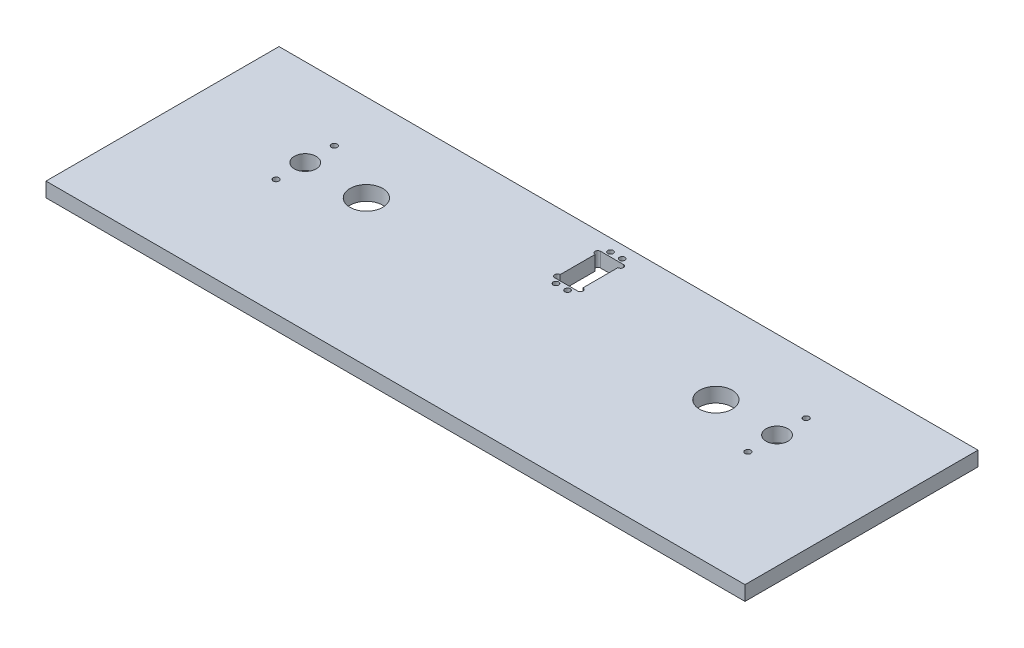
ISO-10303-21;
HEADER;
FILE_DESCRIPTION(('STEP AP214'),'2;1');
FILE_NAME('part.step','',(''),(''),'','','');
FILE_SCHEMA(('AUTOMOTIVE_DESIGN { 1 0 10303 214 1 1 1 1 }'));
ENDSEC;
DATA;
#1=APPLICATION_CONTEXT('core data for automotive mechanical design processes');
#2=APPLICATION_PROTOCOL_DEFINITION('international standard','automotive_design',2000,#1);
#3=PRODUCT_CONTEXT('',#1,'mechanical');
#4=PRODUCT('Part','Part','',(#3));
#5=PRODUCT_RELATED_PRODUCT_CATEGORY('part','',(#4));
#6=PRODUCT_DEFINITION_FORMATION('','',#4);
#7=PRODUCT_DEFINITION_CONTEXT('part definition',#1,'design');
#8=PRODUCT_DEFINITION('design','',#6,#7);
#9=PRODUCT_DEFINITION_SHAPE('','',#8);
#10=(LENGTH_UNIT() NAMED_UNIT(*) SI_UNIT(.MILLI.,.METRE.));
#11=(NAMED_UNIT(*) PLANE_ANGLE_UNIT() SI_UNIT($,.RADIAN.));
#12=(NAMED_UNIT(*) SI_UNIT($,.STERADIAN.) SOLID_ANGLE_UNIT());
#13=UNCERTAINTY_MEASURE_WITH_UNIT(LENGTH_MEASURE(1.E-05),#10,'distance_accuracy_value','');
#14=(GEOMETRIC_REPRESENTATION_CONTEXT(3) GLOBAL_UNCERTAINTY_ASSIGNED_CONTEXT((#13)) GLOBAL_UNIT_ASSIGNED_CONTEXT((#10,
#11,#12)) REPRESENTATION_CONTEXT('',''));
#15=CARTESIAN_POINT('',(0.,0.,0.));
#16=DIRECTION('',(0.,0.,1.));
#17=DIRECTION('',(1.,0.,0.));
#18=AXIS2_PLACEMENT_3D('',#15,#16,#17);
#19=CARTESIAN_POINT('',(0.,12.7,0.));
#20=DIRECTION('',(0.,1.,0.));
#21=DIRECTION('',(0.,0.,1.));
#22=AXIS2_PLACEMENT_3D('',#19,#20,#21);
#23=PLANE('',#22);
#24=CARTESIAN_POINT('',(157.48,12.7,-65.6070452432344));
#25=DIRECTION('',(0.,1.,0.));
#26=DIRECTION('',(0.,0.,1.));
#27=AXIS2_PLACEMENT_3D('',#24,#25,#26);
#28=CIRCLE('',#27,2.38378999999998);
#29=CARTESIAN_POINT('',(157.48,12.7,-63.2232552432344));
#30=VERTEX_POINT('',#29);
#31=EDGE_CURVE('E586',#30,#30,#28,.T.);
#32=ORIENTED_EDGE('',*,*,#31,.F.);
#33=EDGE_LOOP('',(#32));
#34=FACE_BOUND('',#33,.T.);
#35=CARTESIAN_POINT('',(147.32,12.7,-65.6070452432344));
#36=DIRECTION('',(0.,1.,0.));
#37=DIRECTION('',(0.,0.,1.));
#38=AXIS2_PLACEMENT_3D('',#35,#36,#37);
#39=CIRCLE('',#38,2.38378999999998);
#40=CARTESIAN_POINT('',(147.32,12.7,-63.2232552432344));
#41=VERTEX_POINT('',#40);
#42=EDGE_CURVE('E591',#41,#41,#39,.T.);
#43=ORIENTED_EDGE('',*,*,#42,.F.);
#44=EDGE_LOOP('',(#43));
#45=FACE_BOUND('',#44,.T.);
#46=CARTESIAN_POINT('',(147.32,12.7,-17.9820452432344));
#47=DIRECTION('',(0.,1.,0.));
#48=DIRECTION('',(0.,0.,1.));
#49=AXIS2_PLACEMENT_3D('',#46,#47,#48);
#50=CIRCLE('',#49,2.38378999999998);
#51=CARTESIAN_POINT('',(147.32,12.7,-15.5982552432345));
#52=VERTEX_POINT('',#51);
#53=EDGE_CURVE('E599',#52,#52,#50,.T.);
#54=ORIENTED_EDGE('',*,*,#53,.F.);
#55=EDGE_LOOP('',(#54));
#56=FACE_BOUND('',#55,.T.);
#57=CARTESIAN_POINT('',(157.48,12.7,-17.9820452432344));
#58=DIRECTION('',(0.,1.,0.));
#59=DIRECTION('',(0.,0.,1.));
#60=AXIS2_PLACEMENT_3D('',#57,#58,#59);
#61=CIRCLE('',#60,2.38378999999998);
#62=CARTESIAN_POINT('',(157.48,12.7,-15.5982552432345));
#63=VERTEX_POINT('',#62);
#64=EDGE_CURVE('E148',#63,#63,#61,.T.);
#65=ORIENTED_EDGE('',*,*,#64,.F.);
#66=EDGE_LOOP('',(#65));
#67=FACE_BOUND('',#66,.T.);
#68=CARTESIAN_POINT('',(162.3695,12.7,-59.4094452432344));
#69=DIRECTION('',(0.,1.,0.));
#70=DIRECTION('',(0.,0.,-1.));
#71=AXIS2_PLACEMENT_3D('',#68,#69,#70);
#72=CIRCLE('',#71,2.3876);
#73=CARTESIAN_POINT('',(162.3695,12.7,-57.0218452432344));
#74=VERTEX_POINT('',#73);
#75=CARTESIAN_POINT('',(162.3695,12.7,-61.7970452432344));
#76=VERTEX_POINT('',#75);
#77=EDGE_CURVE('E49',#74,#76,#72,.T.);
#78=ORIENTED_EDGE('',*,*,#77,.F.);
#79=DIRECTION('',(0.,0.,-1.));
#80=VECTOR('',#79,1.);
#81=CARTESIAN_POINT('',(162.3695,12.7,-26.5672452432344));
#82=LINE('',#81,#80);
#83=CARTESIAN_POINT('',(162.3695,12.7,-26.5672452432344));
#84=VERTEX_POINT('',#83);
#85=EDGE_CURVE('E142',#84,#74,#82,.T.);
#86=ORIENTED_EDGE('',*,*,#85,.F.);
#87=CARTESIAN_POINT('',(162.3695,12.7,-24.1796452432344));
#88=DIRECTION('',(0.,1.,0.));
#89=DIRECTION('',(0.,0.,1.));
#90=AXIS2_PLACEMENT_3D('',#87,#88,#89);
#91=CIRCLE('',#90,2.38760000000001);
#92=CARTESIAN_POINT('',(162.3695,12.7,-21.7920452432344));
#93=VERTEX_POINT('',#92);
#94=EDGE_CURVE('E145',#93,#84,#91,.T.);
#95=ORIENTED_EDGE('',*,*,#94,.F.);
#96=DIRECTION('',(1.,0.,0.));
#97=VECTOR('',#96,1.);
#98=CARTESIAN_POINT('',(142.4305,12.7,-21.7920452432344));
#99=LINE('',#98,#97);
#100=CARTESIAN_POINT('',(142.4305,12.7,-21.7920452432344));
#101=VERTEX_POINT('',#100);
#102=EDGE_CURVE('E177',#101,#93,#99,.T.);
#103=ORIENTED_EDGE('',*,*,#102,.F.);
#104=CARTESIAN_POINT('',(142.4305,12.7,-24.1796452432344));
#105=DIRECTION('',(0.,1.,0.));
#106=DIRECTION('',(0.,0.,-1.));
#107=AXIS2_PLACEMENT_3D('',#104,#105,#106);
#108=CIRCLE('',#107,2.3876);
#109=CARTESIAN_POINT('',(142.4305,12.7,-26.5672452432344));
#110=VERTEX_POINT('',#109);
#111=EDGE_CURVE('E174',#110,#101,#108,.T.);
#112=ORIENTED_EDGE('',*,*,#111,.F.);
#113=DIRECTION('',(0.,0.,1.));
#114=VECTOR('',#113,1.);
#115=CARTESIAN_POINT('',(142.4305,12.7,-26.5672452432344));
#116=LINE('',#115,#114);
#117=CARTESIAN_POINT('',(142.4305,12.7,-57.0218452432344));
#118=VERTEX_POINT('',#117);
#119=EDGE_CURVE('E171',#118,#110,#116,.T.);
#120=ORIENTED_EDGE('',*,*,#119,.F.);
#121=CARTESIAN_POINT('',(142.4305,12.7,-59.4094452432344));
#122=DIRECTION('',(0.,1.,0.));
#123=DIRECTION('',(0.,0.,1.));
#124=AXIS2_PLACEMENT_3D('',#121,#122,#123);
#125=CIRCLE('',#124,2.3876);
#126=CARTESIAN_POINT('',(142.4305,12.7,-61.7970452432344));
#127=VERTEX_POINT('',#126);
#128=EDGE_CURVE('E168',#127,#118,#125,.T.);
#129=ORIENTED_EDGE('',*,*,#128,.F.);
#130=DIRECTION('',(-1.,0.,0.));
#131=VECTOR('',#130,1.);
#132=CARTESIAN_POINT('',(142.4305,12.7,-61.7970452432344));
#133=LINE('',#132,#131);
#134=EDGE_CURVE('E165',#76,#127,#133,.T.);
#135=ORIENTED_EDGE('',*,*,#134,.F.);
#136=EDGE_LOOP('',(#78,#86,#95,#103,#112,#120,#129,#135));
#137=FACE_BOUND('',#136,.T.);
#138=CARTESIAN_POINT('',(-53.34,12.7,-25.4));
#139=DIRECTION('',(0.,1.,0.));
#140=DIRECTION('',(0.,0.,1.));
#141=AXIS2_PLACEMENT_3D('',#138,#139,#140);
#142=CIRCLE('',#141,2.54);
#143=CARTESIAN_POINT('',(-53.34,12.7,-22.86));
#144=VERTEX_POINT('',#143);
#145=EDGE_CURVE('E238',#144,#144,#142,.T.);
#146=ORIENTED_EDGE('',*,*,#145,.F.);
#147=EDGE_LOOP('',(#146));
#148=FACE_BOUND('',#147,.T.);
#149=CARTESIAN_POINT('',(0.,12.7,0.));
#150=DIRECTION('',(0.,1.,0.));
#151=DIRECTION('',(0.,0.,1.));
#152=AXIS2_PLACEMENT_3D('',#149,#150,#151);
#153=CIRCLE('',#152,14.2875);
#154=CARTESIAN_POINT('',(0.,12.7,14.2875));
#155=VERTEX_POINT('',#154);
#156=EDGE_CURVE('E250',#155,#155,#153,.T.);
#157=ORIENTED_EDGE('',*,*,#156,.F.);
#158=EDGE_LOOP('',(#157));
#159=FACE_BOUND('',#158,.T.);
#160=DIRECTION('',(0.,0.,1.));
#161=VECTOR('',#160,1.);
#162=CARTESIAN_POINT('',(-152.4,12.7,-76.2));
#163=LINE('',#162,#161);
#164=CARTESIAN_POINT('',(-152.4,12.7,-76.2));
#165=VERTEX_POINT('',#164);
#166=CARTESIAN_POINT('',(-152.4,12.7,127.));
#167=VERTEX_POINT('',#166);
#168=EDGE_CURVE('E256',#165,#167,#163,.T.);
#169=ORIENTED_EDGE('',*,*,#168,.T.);
#170=DIRECTION('',(1.,0.,0.));
#171=VECTOR('',#170,1.);
#172=CARTESIAN_POINT('',(-152.4,12.7,127.));
#173=LINE('',#172,#171);
#174=CARTESIAN_POINT('',(457.2,12.7,127.));
#175=VERTEX_POINT('',#174);
#176=EDGE_CURVE('E259',#167,#175,#173,.T.);
#177=ORIENTED_EDGE('',*,*,#176,.T.);
#178=DIRECTION('',(0.,0.,1.));
#179=VECTOR('',#178,1.);
#180=CARTESIAN_POINT('',(457.2,12.7,-76.2));
#181=LINE('',#180,#179);
#182=CARTESIAN_POINT('',(457.2,12.7,-76.2));
#183=VERTEX_POINT('',#182);
#184=EDGE_CURVE('E220',#183,#175,#181,.T.);
#185=ORIENTED_EDGE('',*,*,#184,.F.);
#186=DIRECTION('',(-1.,0.,0.));
#187=VECTOR('',#186,1.);
#188=CARTESIAN_POINT('',(-152.4,12.7,-76.2));
#189=LINE('',#188,#187);
#190=EDGE_CURVE('E262',#183,#165,#189,.T.);
#191=ORIENTED_EDGE('',*,*,#190,.T.);
#192=EDGE_LOOP('',(#169,#177,#185,#191));
#193=FACE_BOUND('',#192,.T.);
#194=CARTESIAN_POINT('',(-53.34,12.7,0.));
#195=DIRECTION('',(0.,1.,0.));
#196=DIRECTION('',(0.,0.,1.));
#197=AXIS2_PLACEMENT_3D('',#194,#195,#196);
#198=CIRCLE('',#197,9.525);
#199=CARTESIAN_POINT('',(-53.34,12.7,9.525));
#200=VERTEX_POINT('',#199);
#201=EDGE_CURVE('E244',#200,#200,#198,.T.);
#202=ORIENTED_EDGE('',*,*,#201,.F.);
#203=EDGE_LOOP('',(#202));
#204=FACE_BOUND('',#203,.T.);
#205=CARTESIAN_POINT('',(-53.34,12.7,25.4));
#206=DIRECTION('',(0.,1.,0.));
#207=DIRECTION('',(0.,0.,1.));
#208=AXIS2_PLACEMENT_3D('',#205,#206,#207);
#209=CIRCLE('',#208,2.54);
#210=CARTESIAN_POINT('',(-53.34,12.7,27.94));
#211=VERTEX_POINT('',#210);
#212=EDGE_CURVE('E232',#211,#211,#209,.T.);
#213=ORIENTED_EDGE('',*,*,#212,.F.);
#214=EDGE_LOOP('',(#213));
#215=FACE_BOUND('',#214,.T.);
#216=CARTESIAN_POINT('',(358.14,12.7,25.4));
#217=DIRECTION('',(0.,-1.,0.));
#218=DIRECTION('',(0.,0.,1.));
#219=AXIS2_PLACEMENT_3D('',#216,#217,#218);
#220=CIRCLE('',#219,2.54);
#221=CARTESIAN_POINT('',(358.14,12.7,27.94));
#222=VERTEX_POINT('',#221);
#223=EDGE_CURVE('E196',#222,#222,#220,.T.);
#224=ORIENTED_EDGE('',*,*,#223,.T.);
#225=EDGE_LOOP('',(#224));
#226=FACE_BOUND('',#225,.T.);
#227=CARTESIAN_POINT('',(358.14,12.7,-25.4));
#228=DIRECTION('',(0.,-1.,0.));
#229=DIRECTION('',(0.,0.,1.));
#230=AXIS2_PLACEMENT_3D('',#227,#228,#229);
#231=CIRCLE('',#230,2.54);
#232=CARTESIAN_POINT('',(358.14,12.7,-22.86));
#233=VERTEX_POINT('',#232);
#234=EDGE_CURVE('E202',#233,#233,#231,.T.);
#235=ORIENTED_EDGE('',*,*,#234,.T.);
#236=EDGE_LOOP('',(#235));
#237=FACE_BOUND('',#236,.T.);
#238=CARTESIAN_POINT('',(358.14,12.7,0.));
#239=DIRECTION('',(0.,-1.,0.));
#240=DIRECTION('',(0.,0.,1.));
#241=AXIS2_PLACEMENT_3D('',#238,#239,#240);
#242=CIRCLE('',#241,9.525);
#243=CARTESIAN_POINT('',(358.14,12.7,9.525));
#244=VERTEX_POINT('',#243);
#245=EDGE_CURVE('E208',#244,#244,#242,.T.);
#246=ORIENTED_EDGE('',*,*,#245,.T.);
#247=EDGE_LOOP('',(#246));
#248=FACE_BOUND('',#247,.T.);
#249=CARTESIAN_POINT('',(304.8,12.7,0.));
#250=DIRECTION('',(0.,-1.,0.));
#251=DIRECTION('',(0.,0.,1.));
#252=AXIS2_PLACEMENT_3D('',#249,#250,#251);
#253=CIRCLE('',#252,14.2875);
#254=CARTESIAN_POINT('',(304.8,12.7,14.2875));
#255=VERTEX_POINT('',#254);
#256=EDGE_CURVE('E214',#255,#255,#253,.T.);
#257=ORIENTED_EDGE('',*,*,#256,.T.);
#258=EDGE_LOOP('',(#257));
#259=FACE_BOUND('',#258,.T.);
#260=ADVANCED_FACE('F34',(#34,#45,#56,#67,#137,#148,#159,#193,#204,#215,#226,#237,#248,#259),
#23,.T.);
#261=CARTESIAN_POINT('',(0.,0.,0.));
#262=DIRECTION('',(0.,1.,0.));
#263=DIRECTION('',(0.,0.,1.));
#264=AXIS2_PLACEMENT_3D('',#261,#262,#263);
#265=PLANE('',#264);
#266=CARTESIAN_POINT('',(157.48,0.,-65.6070452432344));
#267=DIRECTION('',(0.,1.,0.));
#268=DIRECTION('',(0.,0.,1.));
#269=AXIS2_PLACEMENT_3D('',#266,#267,#268);
#270=CIRCLE('',#269,2.38378999999998);
#271=CARTESIAN_POINT('',(157.48,0.,-63.2232552432344));
#272=VERTEX_POINT('',#271);
#273=EDGE_CURVE('E166',#272,#272,#270,.T.);
#274=ORIENTED_EDGE('',*,*,#273,.T.);
#275=EDGE_LOOP('',(#274));
#276=FACE_BOUND('',#275,.T.);
#277=CARTESIAN_POINT('',(147.32,0.,-65.6070452432344));
#278=DIRECTION('',(0.,1.,0.));
#279=DIRECTION('',(0.,0.,1.));
#280=AXIS2_PLACEMENT_3D('',#277,#278,#279);
#281=CIRCLE('',#280,2.38378999999998);
#282=CARTESIAN_POINT('',(147.32,0.,-63.2232552432344));
#283=VERTEX_POINT('',#282);
#284=EDGE_CURVE('E587',#283,#283,#281,.T.);
#285=ORIENTED_EDGE('',*,*,#284,.T.);
#286=EDGE_LOOP('',(#285));
#287=FACE_BOUND('',#286,.T.);
#288=CARTESIAN_POINT('',(147.32,0.,-17.9820452432344));
#289=DIRECTION('',(0.,1.,0.));
#290=DIRECTION('',(0.,0.,1.));
#291=AXIS2_PLACEMENT_3D('',#288,#289,#290);
#292=CIRCLE('',#291,2.38378999999998);
#293=CARTESIAN_POINT('',(147.32,0.,-15.5982552432345));
#294=VERTEX_POINT('',#293);
#295=EDGE_CURVE('E596',#294,#294,#292,.T.);
#296=ORIENTED_EDGE('',*,*,#295,.T.);
#297=EDGE_LOOP('',(#296));
#298=FACE_BOUND('',#297,.T.);
#299=CARTESIAN_POINT('',(157.48,0.,-17.9820452432344));
#300=DIRECTION('',(0.,1.,0.));
#301=DIRECTION('',(0.,0.,1.));
#302=AXIS2_PLACEMENT_3D('',#299,#300,#301);
#303=CIRCLE('',#302,2.38378999999998);
#304=CARTESIAN_POINT('',(157.48,0.,-15.5982552432345));
#305=VERTEX_POINT('',#304);
#306=EDGE_CURVE('E601',#305,#305,#303,.T.);
#307=ORIENTED_EDGE('',*,*,#306,.T.);
#308=EDGE_LOOP('',(#307));
#309=FACE_BOUND('',#308,.T.);
#310=DIRECTION('',(0.,0.,-1.));
#311=VECTOR('',#310,1.);
#312=CARTESIAN_POINT('',(162.3695,0.,-26.5672452432344));
#313=LINE('',#312,#311);
#314=CARTESIAN_POINT('',(162.3695,0.,-26.5672452432344));
#315=VERTEX_POINT('',#314);
#316=CARTESIAN_POINT('',(162.3695,0.,-57.0218452432344));
#317=VERTEX_POINT('',#316);
#318=EDGE_CURVE('E131',#315,#317,#313,.T.);
#319=ORIENTED_EDGE('',*,*,#318,.T.);
#320=CARTESIAN_POINT('',(162.3695,0.,-59.4094452432344));
#321=DIRECTION('',(0.,1.,0.));
#322=DIRECTION('',(0.,0.,-1.));
#323=AXIS2_PLACEMENT_3D('',#320,#321,#322);
#324=CIRCLE('',#323,2.3876);
#325=CARTESIAN_POINT('',(162.3695,0.,-61.7970452432344));
#326=VERTEX_POINT('',#325);
#327=EDGE_CURVE('E125',#317,#326,#324,.T.);
#328=ORIENTED_EDGE('',*,*,#327,.T.);
#329=DIRECTION('',(-1.,0.,0.));
#330=VECTOR('',#329,1.);
#331=CARTESIAN_POINT('',(142.4305,0.,-61.7970452432344));
#332=LINE('',#331,#330);
#333=CARTESIAN_POINT('',(142.4305,0.,-61.7970452432344));
#334=VERTEX_POINT('',#333);
#335=EDGE_CURVE('E134',#326,#334,#332,.T.);
#336=ORIENTED_EDGE('',*,*,#335,.T.);
#337=CARTESIAN_POINT('',(142.4305,0.,-59.4094452432344));
#338=DIRECTION('',(0.,1.,0.));
#339=DIRECTION('',(0.,0.,1.));
#340=AXIS2_PLACEMENT_3D('',#337,#338,#339);
#341=CIRCLE('',#340,2.3876);
#342=CARTESIAN_POINT('',(142.4305,0.,-57.0218452432344));
#343=VERTEX_POINT('',#342);
#344=EDGE_CURVE('E57',#334,#343,#341,.T.);
#345=ORIENTED_EDGE('',*,*,#344,.T.);
#346=DIRECTION('',(0.,0.,1.));
#347=VECTOR('',#346,1.);
#348=CARTESIAN_POINT('',(142.4305,0.,-26.5672452432344));
#349=LINE('',#348,#347);
#350=CARTESIAN_POINT('',(142.4305,0.,-26.5672452432344));
#351=VERTEX_POINT('',#350);
#352=EDGE_CURVE('E152',#343,#351,#349,.T.);
#353=ORIENTED_EDGE('',*,*,#352,.T.);
#354=CARTESIAN_POINT('',(142.4305,0.,-24.1796452432344));
#355=DIRECTION('',(0.,1.,0.));
#356=DIRECTION('',(0.,0.,-1.));
#357=AXIS2_PLACEMENT_3D('',#354,#355,#356);
#358=CIRCLE('',#357,2.3876);
#359=CARTESIAN_POINT('',(142.4305,0.,-21.7920452432344));
#360=VERTEX_POINT('',#359);
#361=EDGE_CURVE('E155',#351,#360,#358,.T.);
#362=ORIENTED_EDGE('',*,*,#361,.T.);
#363=DIRECTION('',(1.,0.,0.));
#364=VECTOR('',#363,1.);
#365=CARTESIAN_POINT('',(142.4305,0.,-21.7920452432344));
#366=LINE('',#365,#364);
#367=CARTESIAN_POINT('',(162.3695,0.,-21.7920452432344));
#368=VERTEX_POINT('',#367);
#369=EDGE_CURVE('E158',#360,#368,#366,.T.);
#370=ORIENTED_EDGE('',*,*,#369,.T.);
#371=CARTESIAN_POINT('',(162.3695,0.,-24.1796452432344));
#372=DIRECTION('',(0.,1.,0.));
#373=DIRECTION('',(0.,0.,1.));
#374=AXIS2_PLACEMENT_3D('',#371,#372,#373);
#375=CIRCLE('',#374,2.38760000000001);
#376=EDGE_CURVE('E161',#368,#315,#375,.T.);
#377=ORIENTED_EDGE('',*,*,#376,.T.);
#378=EDGE_LOOP('',(#319,#328,#336,#345,#353,#362,#370,#377));
#379=FACE_BOUND('',#378,.T.);
#380=DIRECTION('',(0.,0.,1.));
#381=VECTOR('',#380,1.);
#382=CARTESIAN_POINT('',(-152.4,0.,-76.2));
#383=LINE('',#382,#381);
#384=CARTESIAN_POINT('',(-152.4,0.,-76.2));
#385=VERTEX_POINT('',#384);
#386=CARTESIAN_POINT('',(-152.4,0.,127.));
#387=VERTEX_POINT('',#386);
#388=EDGE_CURVE('E253',#385,#387,#383,.T.);
#389=ORIENTED_EDGE('',*,*,#388,.F.);
#390=DIRECTION('',(-1.,0.,0.));
#391=VECTOR('',#390,1.);
#392=CARTESIAN_POINT('',(-152.4,0.,-76.2));
#393=LINE('',#392,#391);
#394=CARTESIAN_POINT('',(457.2,0.,-76.2));
#395=VERTEX_POINT('',#394);
#396=EDGE_CURVE('E260',#395,#385,#393,.T.);
#397=ORIENTED_EDGE('',*,*,#396,.F.);
#398=DIRECTION('',(0.,0.,1.));
#399=VECTOR('',#398,1.);
#400=CARTESIAN_POINT('',(457.2,0.,-76.2));
#401=LINE('',#400,#399);
#402=CARTESIAN_POINT('',(457.2,0.,127.));
#403=VERTEX_POINT('',#402);
#404=EDGE_CURVE('E217',#395,#403,#401,.T.);
#405=ORIENTED_EDGE('',*,*,#404,.T.);
#406=DIRECTION('',(1.,0.,0.));
#407=VECTOR('',#406,1.);
#408=CARTESIAN_POINT('',(-152.4,0.,127.));
#409=LINE('',#408,#407);
#410=EDGE_CURVE('E266',#387,#403,#409,.T.);
#411=ORIENTED_EDGE('',*,*,#410,.F.);
#412=EDGE_LOOP('',(#389,#397,#405,#411));
#413=FACE_BOUND('',#412,.T.);
#414=CARTESIAN_POINT('',(0.,0.,0.));
#415=DIRECTION('',(0.,1.,0.));
#416=DIRECTION('',(0.,0.,1.));
#417=AXIS2_PLACEMENT_3D('',#414,#415,#416);
#418=CIRCLE('',#417,14.2875);
#419=CARTESIAN_POINT('',(0.,0.,14.2875));
#420=VERTEX_POINT('',#419);
#421=EDGE_CURVE('E247',#420,#420,#418,.T.);
#422=ORIENTED_EDGE('',*,*,#421,.T.);
#423=EDGE_LOOP('',(#422));
#424=FACE_BOUND('',#423,.T.);
#425=CARTESIAN_POINT('',(-53.34,0.,0.));
#426=DIRECTION('',(0.,1.,0.));
#427=DIRECTION('',(0.,0.,1.));
#428=AXIS2_PLACEMENT_3D('',#425,#426,#427);
#429=CIRCLE('',#428,9.525);
#430=CARTESIAN_POINT('',(-53.34,0.,9.525));
#431=VERTEX_POINT('',#430);
#432=EDGE_CURVE('E241',#431,#431,#429,.T.);
#433=ORIENTED_EDGE('',*,*,#432,.T.);
#434=EDGE_LOOP('',(#433));
#435=FACE_BOUND('',#434,.T.);
#436=CARTESIAN_POINT('',(-53.34,0.,-25.4));
#437=DIRECTION('',(0.,1.,0.));
#438=DIRECTION('',(0.,0.,1.));
#439=AXIS2_PLACEMENT_3D('',#436,#437,#438);
#440=CIRCLE('',#439,2.54);
#441=CARTESIAN_POINT('',(-53.34,0.,-22.86));
#442=VERTEX_POINT('',#441);
#443=EDGE_CURVE('E235',#442,#442,#440,.T.);
#444=ORIENTED_EDGE('',*,*,#443,.T.);
#445=EDGE_LOOP('',(#444));
#446=FACE_BOUND('',#445,.T.);
#447=CARTESIAN_POINT('',(-53.34,0.,25.4));
#448=DIRECTION('',(0.,1.,0.));
#449=DIRECTION('',(0.,0.,1.));
#450=AXIS2_PLACEMENT_3D('',#447,#448,#449);
#451=CIRCLE('',#450,2.54);
#452=CARTESIAN_POINT('',(-53.34,0.,27.94));
#453=VERTEX_POINT('',#452);
#454=EDGE_CURVE('E231',#453,#453,#451,.T.);
#455=ORIENTED_EDGE('',*,*,#454,.T.);
#456=EDGE_LOOP('',(#455));
#457=FACE_BOUND('',#456,.T.);
#458=CARTESIAN_POINT('',(358.14,0.,25.4));
#459=DIRECTION('',(0.,-1.,0.));
#460=DIRECTION('',(0.,0.,1.));
#461=AXIS2_PLACEMENT_3D('',#458,#459,#460);
#462=CIRCLE('',#461,2.54);
#463=CARTESIAN_POINT('',(358.14,0.,27.94));
#464=VERTEX_POINT('',#463);
#465=EDGE_CURVE('E184',#464,#464,#462,.T.);
#466=ORIENTED_EDGE('',*,*,#465,.F.);
#467=EDGE_LOOP('',(#466));
#468=FACE_BOUND('',#467,.T.);
#469=CARTESIAN_POINT('',(358.14,0.,-25.4));
#470=DIRECTION('',(0.,-1.,0.));
#471=DIRECTION('',(0.,0.,1.));
#472=AXIS2_PLACEMENT_3D('',#469,#470,#471);
#473=CIRCLE('',#472,2.54);
#474=CARTESIAN_POINT('',(358.14,0.,-22.86));
#475=VERTEX_POINT('',#474);
#476=EDGE_CURVE('E199',#475,#475,#473,.T.);
#477=ORIENTED_EDGE('',*,*,#476,.F.);
#478=EDGE_LOOP('',(#477));
#479=FACE_BOUND('',#478,.T.);
#480=CARTESIAN_POINT('',(358.14,0.,0.));
#481=DIRECTION('',(0.,-1.,0.));
#482=DIRECTION('',(0.,0.,1.));
#483=AXIS2_PLACEMENT_3D('',#480,#481,#482);
#484=CIRCLE('',#483,9.525);
#485=CARTESIAN_POINT('',(358.14,0.,9.525));
#486=VERTEX_POINT('',#485);
#487=EDGE_CURVE('E205',#486,#486,#484,.T.);
#488=ORIENTED_EDGE('',*,*,#487,.F.);
#489=EDGE_LOOP('',(#488));
#490=FACE_BOUND('',#489,.T.);
#491=CARTESIAN_POINT('',(304.8,0.,0.));
#492=DIRECTION('',(0.,-1.,0.));
#493=DIRECTION('',(0.,0.,1.));
#494=AXIS2_PLACEMENT_3D('',#491,#492,#493);
#495=CIRCLE('',#494,14.2875);
#496=CARTESIAN_POINT('',(304.8,0.,14.2875));
#497=VERTEX_POINT('',#496);
#498=EDGE_CURVE('E211',#497,#497,#495,.T.);
#499=ORIENTED_EDGE('',*,*,#498,.F.);
#500=EDGE_LOOP('',(#499));
#501=FACE_BOUND('',#500,.T.);
#502=ADVANCED_FACE('F138',(#276,#287,#298,#309,#379,#413,#424,#435,#446,#457,#468,#479,#490,
#501),#265,.F.);
#503=CARTESIAN_POINT('',(-152.4,12.7,-76.2));
#504=DIRECTION('',(1.,0.,0.));
#505=DIRECTION('',(0.,0.,-1.));
#506=AXIS2_PLACEMENT_3D('',#503,#504,#505);
#507=PLANE('',#506);
#508=ORIENTED_EDGE('',*,*,#388,.T.);
#509=DIRECTION('',(0.,-1.,0.));
#510=VECTOR('',#509,1.);
#511=CARTESIAN_POINT('',(-152.4,12.7,127.));
#512=LINE('',#511,#510);
#513=EDGE_CURVE('E12',#167,#387,#512,.T.);
#514=ORIENTED_EDGE('',*,*,#513,.F.);
#515=ORIENTED_EDGE('',*,*,#168,.F.);
#516=DIRECTION('',(0.,-1.,0.));
#517=VECTOR('',#516,1.);
#518=CARTESIAN_POINT('',(-152.4,12.7,-76.2));
#519=LINE('',#518,#517);
#520=EDGE_CURVE('E42',#165,#385,#519,.T.);
#521=ORIENTED_EDGE('',*,*,#520,.T.);
#522=EDGE_LOOP('',(#508,#514,#515,#521));
#523=FACE_BOUND('',#522,.T.);
#524=ADVANCED_FACE('F36',(#523),#507,.F.);
#525=CARTESIAN_POINT('',(-152.4,12.7,127.));
#526=DIRECTION('',(0.,0.,-1.));
#527=DIRECTION('',(-1.,0.,0.));
#528=AXIS2_PLACEMENT_3D('',#525,#526,#527);
#529=PLANE('',#528);
#530=ORIENTED_EDGE('',*,*,#410,.T.);
#531=DIRECTION('',(0.,-1.,0.));
#532=VECTOR('',#531,1.);
#533=CARTESIAN_POINT('',(457.2,12.7,127.));
#534=LINE('',#533,#532);
#535=EDGE_CURVE('E223',#175,#403,#534,.T.);
#536=ORIENTED_EDGE('',*,*,#535,.F.);
#537=ORIENTED_EDGE('',*,*,#176,.F.);
#538=ORIENTED_EDGE('',*,*,#513,.T.);
#539=EDGE_LOOP('',(#530,#536,#537,#538));
#540=FACE_BOUND('',#539,.T.);
#541=ADVANCED_FACE('F279',(#540),#529,.F.);
#542=CARTESIAN_POINT('',(-152.4,12.7,-76.2));
#543=DIRECTION('',(0.,0.,1.));
#544=DIRECTION('',(1.,0.,0.));
#545=AXIS2_PLACEMENT_3D('',#542,#543,#544);
#546=PLANE('',#545);
#547=ORIENTED_EDGE('',*,*,#396,.T.);
#548=ORIENTED_EDGE('',*,*,#520,.F.);
#549=ORIENTED_EDGE('',*,*,#190,.F.);
#550=DIRECTION('',(0.,-1.,0.));
#551=VECTOR('',#550,1.);
#552=CARTESIAN_POINT('',(457.2,12.7,-76.2));
#553=LINE('',#552,#551);
#554=EDGE_CURVE('E228',#183,#395,#553,.T.);
#555=ORIENTED_EDGE('',*,*,#554,.T.);
#556=EDGE_LOOP('',(#547,#548,#549,#555));
#557=FACE_BOUND('',#556,.T.);
#558=ADVANCED_FACE('F284',(#557),#546,.F.);
#559=CARTESIAN_POINT('',(0.,12.7,0.));
#560=DIRECTION('',(0.,-1.,0.));
#561=DIRECTION('',(0.,0.,-1.));
#562=AXIS2_PLACEMENT_3D('',#559,#560,#561);
#563=CYLINDRICAL_SURFACE('',#562,14.2875);
#564=ORIENTED_EDGE('',*,*,#156,.T.);
#565=EDGE_LOOP('',(#564));
#566=FACE_BOUND('',#565,.T.);
#567=ORIENTED_EDGE('',*,*,#421,.F.);
#568=EDGE_LOOP('',(#567));
#569=FACE_BOUND('',#568,.T.);
#570=ADVANCED_FACE('F312',(#566,#569),#563,.F.);
#571=CARTESIAN_POINT('',(-53.34,12.7,0.));
#572=DIRECTION('',(0.,-1.,0.));
#573=DIRECTION('',(0.,0.,-1.));
#574=AXIS2_PLACEMENT_3D('',#571,#572,#573);
#575=CYLINDRICAL_SURFACE('',#574,9.525);
#576=ORIENTED_EDGE('',*,*,#201,.T.);
#577=EDGE_LOOP('',(#576));
#578=FACE_BOUND('',#577,.T.);
#579=ORIENTED_EDGE('',*,*,#432,.F.);
#580=EDGE_LOOP('',(#579));
#581=FACE_BOUND('',#580,.T.);
#582=ADVANCED_FACE('F527',(#578,#581),#575,.F.);
#583=CARTESIAN_POINT('',(-53.34,12.7,-25.4));
#584=DIRECTION('',(0.,-1.,0.));
#585=DIRECTION('',(0.,0.,-1.));
#586=AXIS2_PLACEMENT_3D('',#583,#584,#585);
#587=CYLINDRICAL_SURFACE('',#586,2.54);
#588=ORIENTED_EDGE('',*,*,#145,.T.);
#589=EDGE_LOOP('',(#588));
#590=FACE_BOUND('',#589,.T.);
#591=ORIENTED_EDGE('',*,*,#443,.F.);
#592=EDGE_LOOP('',(#591));
#593=FACE_BOUND('',#592,.T.);
#594=ADVANCED_FACE('F298',(#590,#593),#587,.F.);
#595=CARTESIAN_POINT('',(-53.34,12.7,25.4));
#596=DIRECTION('',(0.,-1.,0.));
#597=DIRECTION('',(0.,0.,-1.));
#598=AXIS2_PLACEMENT_3D('',#595,#596,#597);
#599=CYLINDRICAL_SURFACE('',#598,2.54);
#600=ORIENTED_EDGE('',*,*,#212,.T.);
#601=EDGE_LOOP('',(#600));
#602=FACE_BOUND('',#601,.T.);
#603=ORIENTED_EDGE('',*,*,#454,.F.);
#604=EDGE_LOOP('',(#603));
#605=FACE_BOUND('',#604,.T.);
#606=ADVANCED_FACE('F289',(#602,#605),#599,.F.);
#607=CARTESIAN_POINT('',(457.2,12.7,-76.2));
#608=DIRECTION('',(1.,0.,0.));
#609=DIRECTION('',(0.,0.,-1.));
#610=AXIS2_PLACEMENT_3D('',#607,#608,#609);
#611=PLANE('',#610);
#612=ORIENTED_EDGE('',*,*,#404,.F.);
#613=ORIENTED_EDGE('',*,*,#554,.F.);
#614=ORIENTED_EDGE('',*,*,#184,.T.);
#615=ORIENTED_EDGE('',*,*,#535,.T.);
#616=EDGE_LOOP('',(#612,#613,#614,#615));
#617=FACE_BOUND('',#616,.T.);
#618=ADVANCED_FACE('F286',(#617),#611,.T.);
#619=CARTESIAN_POINT('',(304.8,12.7,0.));
#620=DIRECTION('',(0.,-1.,0.));
#621=DIRECTION('',(0.,0.,-1.));
#622=AXIS2_PLACEMENT_3D('',#619,#620,#621);
#623=CYLINDRICAL_SURFACE('',#622,14.2875);
#624=ORIENTED_EDGE('',*,*,#256,.F.);
#625=EDGE_LOOP('',(#624));
#626=FACE_BOUND('',#625,.T.);
#627=ORIENTED_EDGE('',*,*,#498,.T.);
#628=EDGE_LOOP('',(#627));
#629=FACE_BOUND('',#628,.T.);
#630=ADVANCED_FACE('F288',(#626,#629),#623,.F.);
#631=CARTESIAN_POINT('',(358.14,12.7,0.));
#632=DIRECTION('',(0.,-1.,0.));
#633=DIRECTION('',(0.,0.,-1.));
#634=AXIS2_PLACEMENT_3D('',#631,#632,#633);
#635=CYLINDRICAL_SURFACE('',#634,9.525);
#636=ORIENTED_EDGE('',*,*,#245,.F.);
#637=EDGE_LOOP('',(#636));
#638=FACE_BOUND('',#637,.T.);
#639=ORIENTED_EDGE('',*,*,#487,.T.);
#640=EDGE_LOOP('',(#639));
#641=FACE_BOUND('',#640,.T.);
#642=ADVANCED_FACE('F295',(#638,#641),#635,.F.);
#643=CARTESIAN_POINT('',(358.14,12.7,-25.4));
#644=DIRECTION('',(0.,-1.,0.));
#645=DIRECTION('',(0.,0.,-1.));
#646=AXIS2_PLACEMENT_3D('',#643,#644,#645);
#647=CYLINDRICAL_SURFACE('',#646,2.54);
#648=ORIENTED_EDGE('',*,*,#234,.F.);
#649=EDGE_LOOP('',(#648));
#650=FACE_BOUND('',#649,.T.);
#651=ORIENTED_EDGE('',*,*,#476,.T.);
#652=EDGE_LOOP('',(#651));
#653=FACE_BOUND('',#652,.T.);
#654=ADVANCED_FACE('F458',(#650,#653),#647,.F.);
#655=CARTESIAN_POINT('',(358.14,12.7,25.4));
#656=DIRECTION('',(0.,-1.,0.));
#657=DIRECTION('',(0.,0.,-1.));
#658=AXIS2_PLACEMENT_3D('',#655,#656,#657);
#659=CYLINDRICAL_SURFACE('',#658,2.54);
#660=ORIENTED_EDGE('',*,*,#223,.F.);
#661=EDGE_LOOP('',(#660));
#662=FACE_BOUND('',#661,.T.);
#663=ORIENTED_EDGE('',*,*,#465,.T.);
#664=EDGE_LOOP('',(#663));
#665=FACE_BOUND('',#664,.T.);
#666=ADVANCED_FACE('F342',(#662,#665),#659,.F.);
#667=CARTESIAN_POINT('',(162.3695,0.,-59.4094452432344));
#668=DIRECTION('',(0.,1.,0.));
#669=DIRECTION('',(0.,0.,1.));
#670=AXIS2_PLACEMENT_3D('',#667,#668,#669);
#671=CYLINDRICAL_SURFACE('',#670,2.3876);
#672=ORIENTED_EDGE('',*,*,#77,.T.);
#673=DIRECTION('',(0.,1.,0.));
#674=VECTOR('',#673,1.);
#675=CARTESIAN_POINT('',(162.3695,0.,-61.7970452432344));
#676=LINE('',#675,#674);
#677=EDGE_CURVE('E121',#326,#76,#676,.T.);
#678=ORIENTED_EDGE('',*,*,#677,.F.);
#679=ORIENTED_EDGE('',*,*,#327,.F.);
#680=DIRECTION('',(0.,1.,0.));
#681=VECTOR('',#680,1.);
#682=CARTESIAN_POINT('',(162.3695,0.,-57.0218452432344));
#683=LINE('',#682,#681);
#684=EDGE_CURVE('E182',#317,#74,#683,.T.);
#685=ORIENTED_EDGE('',*,*,#684,.T.);
#686=EDGE_LOOP('',(#672,#678,#679,#685));
#687=FACE_BOUND('',#686,.T.);
#688=ADVANCED_FACE('F123',(#687),#671,.F.);
#689=CARTESIAN_POINT('',(162.3695,0.,-26.5672452432344));
#690=DIRECTION('',(1.,0.,0.));
#691=DIRECTION('',(0.,0.,-1.));
#692=AXIS2_PLACEMENT_3D('',#689,#690,#691);
#693=PLANE('',#692);
#694=ORIENTED_EDGE('',*,*,#85,.T.);
#695=ORIENTED_EDGE('',*,*,#684,.F.);
#696=ORIENTED_EDGE('',*,*,#318,.F.);
#697=DIRECTION('',(0.,1.,0.));
#698=VECTOR('',#697,1.);
#699=CARTESIAN_POINT('',(162.3695,0.,-26.5672452432344));
#700=LINE('',#699,#698);
#701=EDGE_CURVE('E185',#315,#84,#700,.T.);
#702=ORIENTED_EDGE('',*,*,#701,.T.);
#703=EDGE_LOOP('',(#694,#695,#696,#702));
#704=FACE_BOUND('',#703,.T.);
#705=ADVANCED_FACE('F341',(#704),#693,.F.);
#706=CARTESIAN_POINT('',(162.3695,0.,-24.1796452432344));
#707=DIRECTION('',(0.,1.,0.));
#708=DIRECTION('',(0.,0.,1.));
#709=AXIS2_PLACEMENT_3D('',#706,#707,#708);
#710=CYLINDRICAL_SURFACE('',#709,2.38760000000001);
#711=ORIENTED_EDGE('',*,*,#94,.T.);
#712=ORIENTED_EDGE('',*,*,#701,.F.);
#713=ORIENTED_EDGE('',*,*,#376,.F.);
#714=DIRECTION('',(0.,1.,0.));
#715=VECTOR('',#714,1.);
#716=CARTESIAN_POINT('',(162.3695,0.,-21.7920452432344));
#717=LINE('',#716,#715);
#718=EDGE_CURVE('E187',#368,#93,#717,.T.);
#719=ORIENTED_EDGE('',*,*,#718,.T.);
#720=EDGE_LOOP('',(#711,#712,#713,#719));
#721=FACE_BOUND('',#720,.T.);
#722=ADVANCED_FACE('F353',(#721),#710,.F.);
#723=CARTESIAN_POINT('',(142.4305,0.,-21.7920452432344));
#724=DIRECTION('',(0.,0.,1.));
#725=DIRECTION('',(1.,0.,0.));
#726=AXIS2_PLACEMENT_3D('',#723,#724,#725);
#727=PLANE('',#726);
#728=ORIENTED_EDGE('',*,*,#102,.T.);
#729=ORIENTED_EDGE('',*,*,#718,.F.);
#730=ORIENTED_EDGE('',*,*,#369,.F.);
#731=DIRECTION('',(0.,1.,0.));
#732=VECTOR('',#731,1.);
#733=CARTESIAN_POINT('',(142.4305,0.,-21.7920452432344));
#734=LINE('',#733,#732);
#735=EDGE_CURVE('E189',#360,#101,#734,.T.);
#736=ORIENTED_EDGE('',*,*,#735,.T.);
#737=EDGE_LOOP('',(#728,#729,#730,#736));
#738=FACE_BOUND('',#737,.T.);
#739=ADVANCED_FACE('F363',(#738),#727,.F.);
#740=CARTESIAN_POINT('',(142.4305,0.,-24.1796452432344));
#741=DIRECTION('',(0.,1.,0.));
#742=DIRECTION('',(0.,0.,1.));
#743=AXIS2_PLACEMENT_3D('',#740,#741,#742);
#744=CYLINDRICAL_SURFACE('',#743,2.3876);
#745=ORIENTED_EDGE('',*,*,#111,.T.);
#746=ORIENTED_EDGE('',*,*,#735,.F.);
#747=ORIENTED_EDGE('',*,*,#361,.F.);
#748=DIRECTION('',(0.,1.,0.));
#749=VECTOR('',#748,1.);
#750=CARTESIAN_POINT('',(142.4305,0.,-26.5672452432344));
#751=LINE('',#750,#749);
#752=EDGE_CURVE('E191',#351,#110,#751,.T.);
#753=ORIENTED_EDGE('',*,*,#752,.T.);
#754=EDGE_LOOP('',(#745,#746,#747,#753));
#755=FACE_BOUND('',#754,.T.);
#756=ADVANCED_FACE('F373',(#755),#744,.F.);
#757=CARTESIAN_POINT('',(142.4305,0.,-26.5672452432344));
#758=DIRECTION('',(-1.,0.,0.));
#759=DIRECTION('',(0.,0.,1.));
#760=AXIS2_PLACEMENT_3D('',#757,#758,#759);
#761=PLANE('',#760);
#762=ORIENTED_EDGE('',*,*,#119,.T.);
#763=ORIENTED_EDGE('',*,*,#752,.F.);
#764=ORIENTED_EDGE('',*,*,#352,.F.);
#765=DIRECTION('',(0.,1.,0.));
#766=VECTOR('',#765,1.);
#767=CARTESIAN_POINT('',(142.4305,0.,-57.0218452432344));
#768=LINE('',#767,#766);
#769=EDGE_CURVE('E193',#343,#118,#768,.T.);
#770=ORIENTED_EDGE('',*,*,#769,.T.);
#771=EDGE_LOOP('',(#762,#763,#764,#770));
#772=FACE_BOUND('',#771,.T.);
#773=ADVANCED_FACE('F383',(#772),#761,.F.);
#774=CARTESIAN_POINT('',(142.4305,0.,-59.4094452432344));
#775=DIRECTION('',(0.,1.,0.));
#776=DIRECTION('',(0.,0.,1.));
#777=AXIS2_PLACEMENT_3D('',#774,#775,#776);
#778=CYLINDRICAL_SURFACE('',#777,2.3876);
#779=ORIENTED_EDGE('',*,*,#128,.T.);
#780=ORIENTED_EDGE('',*,*,#769,.F.);
#781=ORIENTED_EDGE('',*,*,#344,.F.);
#782=DIRECTION('',(0.,1.,0.));
#783=VECTOR('',#782,1.);
#784=CARTESIAN_POINT('',(142.4305,0.,-61.7970452432344));
#785=LINE('',#784,#783);
#786=EDGE_CURVE('E130',#334,#127,#785,.T.);
#787=ORIENTED_EDGE('',*,*,#786,.T.);
#788=EDGE_LOOP('',(#779,#780,#781,#787));
#789=FACE_BOUND('',#788,.T.);
#790=ADVANCED_FACE('F393',(#789),#778,.F.);
#791=CARTESIAN_POINT('',(142.4305,0.,-61.7970452432344));
#792=DIRECTION('',(0.,0.,-1.));
#793=DIRECTION('',(-1.,0.,0.));
#794=AXIS2_PLACEMENT_3D('',#791,#792,#793);
#795=PLANE('',#794);
#796=ORIENTED_EDGE('',*,*,#134,.T.);
#797=ORIENTED_EDGE('',*,*,#786,.F.);
#798=ORIENTED_EDGE('',*,*,#335,.F.);
#799=ORIENTED_EDGE('',*,*,#677,.T.);
#800=EDGE_LOOP('',(#796,#797,#798,#799));
#801=FACE_BOUND('',#800,.T.);
#802=ADVANCED_FACE('F135',(#801),#795,.F.);
#803=CARTESIAN_POINT('',(157.48,0.,-17.9820452432344));
#804=DIRECTION('',(0.,1.,0.));
#805=DIRECTION('',(0.,0.,1.));
#806=AXIS2_PLACEMENT_3D('',#803,#804,#805);
#807=CYLINDRICAL_SURFACE('',#806,2.38378999999998);
#808=ORIENTED_EDGE('',*,*,#306,.F.);
#809=EDGE_LOOP('',(#808));
#810=FACE_BOUND('',#809,.T.);
#811=ORIENTED_EDGE('',*,*,#64,.T.);
#812=EDGE_LOOP('',(#811));
#813=FACE_BOUND('',#812,.T.);
#814=ADVANCED_FACE('F411',(#810,#813),#807,.F.);
#815=CARTESIAN_POINT('',(147.32,0.,-17.9820452432344));
#816=DIRECTION('',(0.,1.,0.));
#817=DIRECTION('',(0.,0.,1.));
#818=AXIS2_PLACEMENT_3D('',#815,#816,#817);
#819=CYLINDRICAL_SURFACE('',#818,2.38378999999998);
#820=ORIENTED_EDGE('',*,*,#295,.F.);
#821=EDGE_LOOP('',(#820));
#822=FACE_BOUND('',#821,.T.);
#823=ORIENTED_EDGE('',*,*,#53,.T.);
#824=EDGE_LOOP('',(#823));
#825=FACE_BOUND('',#824,.T.);
#826=ADVANCED_FACE('F420',(#822,#825),#819,.F.);
#827=CARTESIAN_POINT('',(147.32,0.,-65.6070452432344));
#828=DIRECTION('',(0.,1.,0.));
#829=DIRECTION('',(0.,0.,1.));
#830=AXIS2_PLACEMENT_3D('',#827,#828,#829);
#831=CYLINDRICAL_SURFACE('',#830,2.38378999999998);
#832=ORIENTED_EDGE('',*,*,#284,.F.);
#833=EDGE_LOOP('',(#832));
#834=FACE_BOUND('',#833,.T.);
#835=ORIENTED_EDGE('',*,*,#42,.T.);
#836=EDGE_LOOP('',(#835));
#837=FACE_BOUND('',#836,.T.);
#838=ADVANCED_FACE('F430',(#834,#837),#831,.F.);
#839=CARTESIAN_POINT('',(157.48,0.,-65.6070452432344));
#840=DIRECTION('',(0.,1.,0.));
#841=DIRECTION('',(0.,0.,1.));
#842=AXIS2_PLACEMENT_3D('',#839,#840,#841);
#843=CYLINDRICAL_SURFACE('',#842,2.38378999999998);
#844=ORIENTED_EDGE('',*,*,#273,.F.);
#845=EDGE_LOOP('',(#844));
#846=FACE_BOUND('',#845,.T.);
#847=ORIENTED_EDGE('',*,*,#31,.T.);
#848=EDGE_LOOP('',(#847));
#849=FACE_BOUND('',#848,.T.);
#850=ADVANCED_FACE('F440',(#846,#849),#843,.F.);
#851=CLOSED_SHELL('',(#260,#502,#524,#541,#558,#570,#582,#594,#606,#618,#630,#642,#654,#666,
#688,#705,#722,#739,#756,#773,#790,#802,#814,#826,#838,#850));
#852=MANIFOLD_SOLID_BREP('B2',#851);
#853=ADVANCED_BREP_SHAPE_REPRESENTATION('',(#18,#852),#14);
#854=SHAPE_DEFINITION_REPRESENTATION(#9,#853);
ENDSEC;
END-ISO-10303-21;
